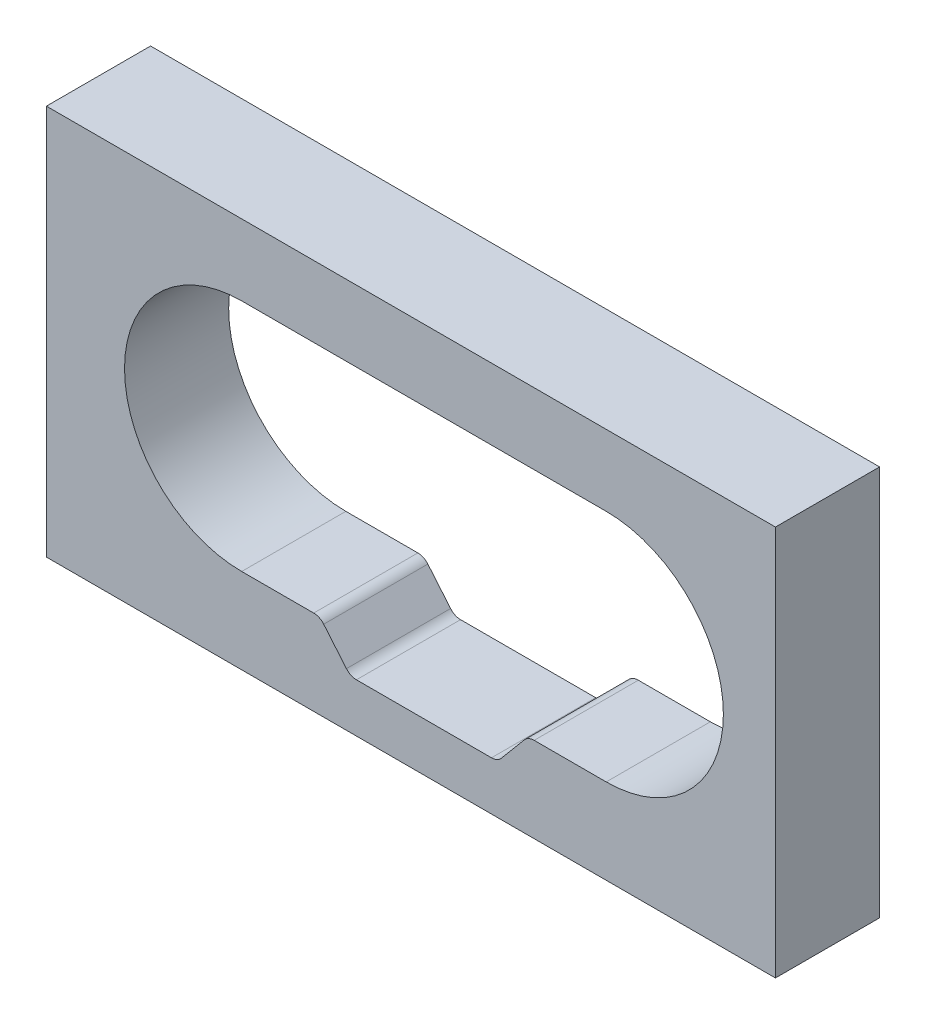
ISO-10303-21;
HEADER;
FILE_DESCRIPTION(('STEP AP214'),'2;1');
FILE_NAME('part.step','',(''),(''),'','','');
FILE_SCHEMA(('AUTOMOTIVE_DESIGN { 1 0 10303 214 1 1 1 1 }'));
ENDSEC;
DATA;
#1=APPLICATION_CONTEXT('core data for automotive mechanical design processes');
#2=APPLICATION_PROTOCOL_DEFINITION('international standard','automotive_design',2000,#1);
#3=PRODUCT_CONTEXT('',#1,'mechanical');
#4=PRODUCT('Part','Part','',(#3));
#5=PRODUCT_RELATED_PRODUCT_CATEGORY('part','',(#4));
#6=PRODUCT_DEFINITION_FORMATION('','',#4);
#7=PRODUCT_DEFINITION_CONTEXT('part definition',#1,'design');
#8=PRODUCT_DEFINITION('design','',#6,#7);
#9=PRODUCT_DEFINITION_SHAPE('','',#8);
#10=(LENGTH_UNIT() NAMED_UNIT(*) SI_UNIT(.MILLI.,.METRE.));
#11=(NAMED_UNIT(*) PLANE_ANGLE_UNIT() SI_UNIT($,.RADIAN.));
#12=(NAMED_UNIT(*) SI_UNIT($,.STERADIAN.) SOLID_ANGLE_UNIT());
#13=UNCERTAINTY_MEASURE_WITH_UNIT(LENGTH_MEASURE(1.E-05),#10,'distance_accuracy_value','');
#14=(GEOMETRIC_REPRESENTATION_CONTEXT(3) GLOBAL_UNCERTAINTY_ASSIGNED_CONTEXT((#13)) GLOBAL_UNIT_ASSIGNED_CONTEXT((#10,
#11,#12)) REPRESENTATION_CONTEXT('',''));
#15=CARTESIAN_POINT('',(0.,0.,0.));
#16=DIRECTION('',(0.,0.,1.));
#17=DIRECTION('',(1.,0.,0.));
#18=AXIS2_PLACEMENT_3D('',#15,#16,#17);
#19=CARTESIAN_POINT('',(0.,0.,8.));
#20=DIRECTION('',(0.,0.,1.));
#21=DIRECTION('',(1.,0.,0.));
#22=AXIS2_PLACEMENT_3D('',#19,#20,#21);
#23=PLANE('',#22);
#24=DIRECTION('',(0.,-1.,0.));
#25=VECTOR('',#24,1.);
#26=CARTESIAN_POINT('',(-15.,14.4560336796941,8.));
#27=LINE('',#26,#25);
#28=CARTESIAN_POINT('',(-15.,14.4560336796941,8.));
#29=VERTEX_POINT('',#28);
#30=CARTESIAN_POINT('',(-15.,-15.5439663203059,8.));
#31=VERTEX_POINT('',#30);
#32=EDGE_CURVE('E221',#29,#31,#27,.T.);
#33=ORIENTED_EDGE('',*,*,#32,.T.);
#34=DIRECTION('',(1.,0.,0.));
#35=VECTOR('',#34,1.);
#36=CARTESIAN_POINT('',(-15.,-15.5439663203059,8.));
#37=LINE('',#36,#35);
#38=CARTESIAN_POINT('',(41.,-15.5439663203059,8.));
#39=VERTEX_POINT('',#38);
#40=EDGE_CURVE('E224',#31,#39,#37,.T.);
#41=ORIENTED_EDGE('',*,*,#40,.T.);
#42=DIRECTION('',(0.,1.,0.));
#43=VECTOR('',#42,1.);
#44=CARTESIAN_POINT('',(41.,14.4560336796941,8.));
#45=LINE('',#44,#43);
#46=CARTESIAN_POINT('',(41.,14.4560336796941,8.));
#47=VERTEX_POINT('',#46);
#48=EDGE_CURVE('E227',#39,#47,#45,.T.);
#49=ORIENTED_EDGE('',*,*,#48,.T.);
#50=DIRECTION('',(-1.,0.,0.));
#51=VECTOR('',#50,1.);
#52=CARTESIAN_POINT('',(-15.,14.4560336796941,8.));
#53=LINE('',#52,#51);
#54=EDGE_CURVE('E229',#47,#29,#53,.T.);
#55=ORIENTED_EDGE('',*,*,#54,.T.);
#56=EDGE_LOOP('',(#33,#41,#49,#55));
#57=FACE_BOUND('',#56,.T.);
#58=DIRECTION('',(1.,0.,0.));
#59=VECTOR('',#58,1.);
#60=CARTESIAN_POINT('',(28.,-9.,8.));
#61=LINE('',#60,#59);
#62=CARTESIAN_POINT('',(22.466892999998,-9.,8.));
#63=VERTEX_POINT('',#62);
#64=CARTESIAN_POINT('',(28.,-9.,8.));
#65=VERTEX_POINT('',#64);
#66=EDGE_CURVE('E190',#63,#65,#61,.T.);
#67=ORIENTED_EDGE('',*,*,#66,.F.);
#68=CARTESIAN_POINT('',(22.466892999998,-10.,8.));
#69=DIRECTION('',(0.,0.,1.));
#70=DIRECTION('',(1.,0.,0.));
#71=AXIS2_PLACEMENT_3D('',#68,#69,#70);
#72=CIRCLE('',#71,1.);
#73=CARTESIAN_POINT('',(21.700230949941,-9.35794914453574,8.));
#74=VERTEX_POINT('',#73);
#75=EDGE_CURVE('E262',#63,#74,#72,.T.);
#76=ORIENTED_EDGE('',*,*,#75,.T.);
#77=DIRECTION('',(0.642050855464262,0.766662050057005,0.));
#78=VECTOR('',#77,1.);
#79=CARTESIAN_POINT('',(22.,-9.,8.));
#80=LINE('',#79,#78);
#81=CARTESIAN_POINT('',(19.9548735447105,-11.4420508554643,8.));
#82=VERTEX_POINT('',#81);
#83=EDGE_CURVE('E187',#82,#74,#80,.T.);
#84=ORIENTED_EDGE('',*,*,#83,.F.);
#85=CARTESIAN_POINT('',(19.1882114946535,-10.8,8.));
#86=DIRECTION('',(0.,0.,1.));
#87=DIRECTION('',(1.,0.,0.));
#88=AXIS2_PLACEMENT_3D('',#85,#86,#87);
#89=CIRCLE('',#88,1.);
#90=CARTESIAN_POINT('',(19.1882114946535,-11.8,8.));
#91=VERTEX_POINT('',#90);
#92=EDGE_CURVE('E277',#82,#91,#89,.F.);
#93=ORIENTED_EDGE('',*,*,#92,.T.);
#94=DIRECTION('',(1.,0.,0.));
#95=VECTOR('',#94,1.);
#96=CARTESIAN_POINT('',(8.34489550534849,-11.8,8.));
#97=LINE('',#96,#95);
#98=CARTESIAN_POINT('',(8.8117885053465,-11.8,8.));
#99=VERTEX_POINT('',#98);
#100=EDGE_CURVE('E182',#99,#91,#97,.T.);
#101=ORIENTED_EDGE('',*,*,#100,.F.);
#102=CARTESIAN_POINT('',(8.8117885053465,-10.8,8.));
#103=DIRECTION('',(0.,0.,1.));
#104=DIRECTION('',(1.,0.,0.));
#105=AXIS2_PLACEMENT_3D('',#102,#103,#104);
#106=CIRCLE('',#105,1.);
#107=CARTESIAN_POINT('',(8.0451264552895,-11.4420508554643,8.));
#108=VERTEX_POINT('',#107);
#109=EDGE_CURVE('E11',#99,#108,#106,.F.);
#110=ORIENTED_EDGE('',*,*,#109,.T.);
#111=DIRECTION('',(0.642050855464261,-0.766662050057005,0.));
#112=VECTOR('',#111,1.);
#113=CARTESIAN_POINT('',(6.,-9.,8.));
#114=LINE('',#113,#112);
#115=CARTESIAN_POINT('',(6.299769050059,-9.35794914453574,8.));
#116=VERTEX_POINT('',#115);
#117=EDGE_CURVE('E180',#116,#108,#114,.T.);
#118=ORIENTED_EDGE('',*,*,#117,.F.);
#119=CARTESIAN_POINT('',(5.53310700000199,-10.,8.));
#120=DIRECTION('',(0.,0.,1.));
#121=DIRECTION('',(1.,0.,0.));
#122=AXIS2_PLACEMENT_3D('',#119,#120,#121);
#123=CIRCLE('',#122,1.);
#124=CARTESIAN_POINT('',(5.53310700000199,-9.,8.));
#125=VERTEX_POINT('',#124);
#126=EDGE_CURVE('E179',#116,#125,#123,.T.);
#127=ORIENTED_EDGE('',*,*,#126,.T.);
#128=DIRECTION('',(1.,0.,0.));
#129=VECTOR('',#128,1.);
#130=CARTESIAN_POINT('',(0.,-9.,8.));
#131=LINE('',#130,#129);
#132=CARTESIAN_POINT('',(0.,-9.,8.));
#133=VERTEX_POINT('',#132);
#134=EDGE_CURVE('E164',#133,#125,#131,.T.);
#135=ORIENTED_EDGE('',*,*,#134,.F.);
#136=CARTESIAN_POINT('',(0.,0.,8.));
#137=DIRECTION('',(0.,0.,1.));
#138=DIRECTION('',(1.,0.,0.));
#139=AXIS2_PLACEMENT_3D('',#136,#137,#138);
#140=CIRCLE('',#139,9.);
#141=CARTESIAN_POINT('',(0.,9.,8.));
#142=VERTEX_POINT('',#141);
#143=EDGE_CURVE('E155',#142,#133,#140,.T.);
#144=ORIENTED_EDGE('',*,*,#143,.F.);
#145=DIRECTION('',(-1.,0.,0.));
#146=VECTOR('',#145,1.);
#147=CARTESIAN_POINT('',(0.,9.,8.));
#148=LINE('',#147,#146);
#149=CARTESIAN_POINT('',(28.,9.,8.));
#150=VERTEX_POINT('',#149);
#151=EDGE_CURVE('E195',#150,#142,#148,.T.);
#152=ORIENTED_EDGE('',*,*,#151,.F.);
#153=CARTESIAN_POINT('',(28.,0.,8.));
#154=DIRECTION('',(0.,0.,1.));
#155=DIRECTION('',(1.,0.,0.));
#156=AXIS2_PLACEMENT_3D('',#153,#154,#155);
#157=CIRCLE('',#156,9.);
#158=EDGE_CURVE('E192',#65,#150,#157,.T.);
#159=ORIENTED_EDGE('',*,*,#158,.F.);
#160=EDGE_LOOP('',(#67,#76,#84,#93,#101,#110,#118,#127,#135,#144,#152,#159));
#161=FACE_BOUND('',#160,.T.);
#162=ADVANCED_FACE('F41',(#57,#161),#23,.T.);
#163=CARTESIAN_POINT('',(0.,0.,0.));
#164=DIRECTION('',(0.,0.,1.));
#165=DIRECTION('',(1.,0.,0.));
#166=AXIS2_PLACEMENT_3D('',#163,#164,#165);
#167=PLANE('',#166);
#168=DIRECTION('',(0.,-1.,0.));
#169=VECTOR('',#168,1.);
#170=CARTESIAN_POINT('',(-15.,14.4560336796941,0.));
#171=LINE('',#170,#169);
#172=CARTESIAN_POINT('',(-15.,14.4560336796941,0.));
#173=VERTEX_POINT('',#172);
#174=CARTESIAN_POINT('',(-15.,-15.5439663203059,0.));
#175=VERTEX_POINT('',#174);
#176=EDGE_CURVE('E174',#173,#175,#171,.T.);
#177=ORIENTED_EDGE('',*,*,#176,.F.);
#178=DIRECTION('',(-1.,0.,0.));
#179=VECTOR('',#178,1.);
#180=CARTESIAN_POINT('',(-15.,14.4560336796941,0.));
#181=LINE('',#180,#179);
#182=CARTESIAN_POINT('',(41.,14.4560336796941,0.));
#183=VERTEX_POINT('',#182);
#184=EDGE_CURVE('E225',#183,#173,#181,.T.);
#185=ORIENTED_EDGE('',*,*,#184,.F.);
#186=DIRECTION('',(0.,1.,0.));
#187=VECTOR('',#186,1.);
#188=CARTESIAN_POINT('',(41.,14.4560336796941,0.));
#189=LINE('',#188,#187);
#190=CARTESIAN_POINT('',(41.,-15.5439663203059,0.));
#191=VERTEX_POINT('',#190);
#192=EDGE_CURVE('E236',#191,#183,#189,.T.);
#193=ORIENTED_EDGE('',*,*,#192,.F.);
#194=DIRECTION('',(1.,0.,0.));
#195=VECTOR('',#194,1.);
#196=CARTESIAN_POINT('',(-15.,-15.5439663203059,0.));
#197=LINE('',#196,#195);
#198=EDGE_CURVE('E234',#175,#191,#197,.T.);
#199=ORIENTED_EDGE('',*,*,#198,.F.);
#200=EDGE_LOOP('',(#177,#185,#193,#199));
#201=FACE_BOUND('',#200,.T.);
#202=DIRECTION('',(0.642050855464262,0.766662050057005,0.));
#203=VECTOR('',#202,1.);
#204=CARTESIAN_POINT('',(22.,-9.,0.));
#205=LINE('',#204,#203);
#206=CARTESIAN_POINT('',(19.9548735447105,-11.4420508554643,0.));
#207=VERTEX_POINT('',#206);
#208=CARTESIAN_POINT('',(21.700230949941,-9.35794914453574,0.));
#209=VERTEX_POINT('',#208);
#210=EDGE_CURVE('E206',#207,#209,#205,.T.);
#211=ORIENTED_EDGE('',*,*,#210,.T.);
#212=CARTESIAN_POINT('',(22.466892999998,-10.,0.));
#213=DIRECTION('',(0.,0.,1.));
#214=DIRECTION('',(1.,0.,0.));
#215=AXIS2_PLACEMENT_3D('',#212,#213,#214);
#216=CIRCLE('',#215,1.);
#217=CARTESIAN_POINT('',(22.466892999998,-9.,0.));
#218=VERTEX_POINT('',#217);
#219=EDGE_CURVE('E257',#209,#218,#216,.F.);
#220=ORIENTED_EDGE('',*,*,#219,.T.);
#221=DIRECTION('',(1.,0.,0.));
#222=VECTOR('',#221,1.);
#223=CARTESIAN_POINT('',(28.,-9.,0.));
#224=LINE('',#223,#222);
#225=CARTESIAN_POINT('',(28.,-9.,0.));
#226=VERTEX_POINT('',#225);
#227=EDGE_CURVE('E209',#218,#226,#224,.T.);
#228=ORIENTED_EDGE('',*,*,#227,.T.);
#229=CARTESIAN_POINT('',(28.,0.,0.));
#230=DIRECTION('',(0.,0.,1.));
#231=DIRECTION('',(1.,0.,0.));
#232=AXIS2_PLACEMENT_3D('',#229,#230,#231);
#233=CIRCLE('',#232,9.);
#234=CARTESIAN_POINT('',(28.,9.,0.));
#235=VERTEX_POINT('',#234);
#236=EDGE_CURVE('E211',#226,#235,#233,.T.);
#237=ORIENTED_EDGE('',*,*,#236,.T.);
#238=DIRECTION('',(-1.,0.,0.));
#239=VECTOR('',#238,1.);
#240=CARTESIAN_POINT('',(0.,9.,0.));
#241=LINE('',#240,#239);
#242=CARTESIAN_POINT('',(0.,9.,0.));
#243=VERTEX_POINT('',#242);
#244=EDGE_CURVE('E165',#235,#243,#241,.T.);
#245=ORIENTED_EDGE('',*,*,#244,.T.);
#246=CARTESIAN_POINT('',(0.,0.,0.));
#247=DIRECTION('',(0.,0.,1.));
#248=DIRECTION('',(1.,0.,0.));
#249=AXIS2_PLACEMENT_3D('',#246,#247,#248);
#250=CIRCLE('',#249,9.);
#251=CARTESIAN_POINT('',(0.,-9.,0.));
#252=VERTEX_POINT('',#251);
#253=EDGE_CURVE('E197',#243,#252,#250,.T.);
#254=ORIENTED_EDGE('',*,*,#253,.T.);
#255=DIRECTION('',(1.,0.,0.));
#256=VECTOR('',#255,1.);
#257=CARTESIAN_POINT('',(0.,-9.,0.));
#258=LINE('',#257,#256);
#259=CARTESIAN_POINT('',(5.53310700000199,-9.,0.));
#260=VERTEX_POINT('',#259);
#261=EDGE_CURVE('E173',#252,#260,#258,.T.);
#262=ORIENTED_EDGE('',*,*,#261,.T.);
#263=CARTESIAN_POINT('',(5.53310700000199,-10.,0.));
#264=DIRECTION('',(0.,0.,1.));
#265=DIRECTION('',(1.,0.,0.));
#266=AXIS2_PLACEMENT_3D('',#263,#264,#265);
#267=CIRCLE('',#266,1.);
#268=CARTESIAN_POINT('',(6.299769050059,-9.35794914453574,0.));
#269=VERTEX_POINT('',#268);
#270=EDGE_CURVE('E255',#260,#269,#267,.F.);
#271=ORIENTED_EDGE('',*,*,#270,.T.);
#272=DIRECTION('',(0.642050855464261,-0.766662050057005,0.));
#273=VECTOR('',#272,1.);
#274=CARTESIAN_POINT('',(6.,-9.,0.));
#275=LINE('',#274,#273);
#276=CARTESIAN_POINT('',(8.0451264552895,-11.4420508554643,0.));
#277=VERTEX_POINT('',#276);
#278=EDGE_CURVE('E200',#269,#277,#275,.T.);
#279=ORIENTED_EDGE('',*,*,#278,.T.);
#280=CARTESIAN_POINT('',(8.8117885053465,-10.8,0.));
#281=DIRECTION('',(0.,0.,1.));
#282=DIRECTION('',(1.,0.,0.));
#283=AXIS2_PLACEMENT_3D('',#280,#281,#282);
#284=CIRCLE('',#283,1.);
#285=CARTESIAN_POINT('',(8.8117885053465,-11.8,0.));
#286=VERTEX_POINT('',#285);
#287=EDGE_CURVE('E49',#277,#286,#284,.T.);
#288=ORIENTED_EDGE('',*,*,#287,.T.);
#289=DIRECTION('',(1.,0.,0.));
#290=VECTOR('',#289,1.);
#291=CARTESIAN_POINT('',(8.34489550534849,-11.8,0.));
#292=LINE('',#291,#290);
#293=CARTESIAN_POINT('',(19.1882114946535,-11.8,0.));
#294=VERTEX_POINT('',#293);
#295=EDGE_CURVE('E203',#286,#294,#292,.T.);
#296=ORIENTED_EDGE('',*,*,#295,.T.);
#297=CARTESIAN_POINT('',(19.1882114946535,-10.8,0.));
#298=DIRECTION('',(0.,0.,1.));
#299=DIRECTION('',(1.,0.,0.));
#300=AXIS2_PLACEMENT_3D('',#297,#298,#299);
#301=CIRCLE('',#300,1.);
#302=EDGE_CURVE('E275',#294,#207,#301,.T.);
#303=ORIENTED_EDGE('',*,*,#302,.T.);
#304=EDGE_LOOP('',(#211,#220,#228,#237,#245,#254,#262,#271,#279,#288,#296,#303));
#305=FACE_BOUND('',#304,.T.);
#306=ADVANCED_FACE('F280',(#201,#305),#167,.F.);
#307=CARTESIAN_POINT('',(-15.,14.4560336796941,8.));
#308=DIRECTION('',(1.,0.,0.));
#309=DIRECTION('',(0.,1.,0.));
#310=AXIS2_PLACEMENT_3D('',#307,#308,#309);
#311=PLANE('',#310);
#312=ORIENTED_EDGE('',*,*,#176,.T.);
#313=DIRECTION('',(0.,0.,-1.));
#314=VECTOR('',#313,1.);
#315=CARTESIAN_POINT('',(-15.,-15.5439663203059,8.));
#316=LINE('',#315,#314);
#317=EDGE_CURVE('E247',#31,#175,#316,.T.);
#318=ORIENTED_EDGE('',*,*,#317,.F.);
#319=ORIENTED_EDGE('',*,*,#32,.F.);
#320=DIRECTION('',(0.,0.,-1.));
#321=VECTOR('',#320,1.);
#322=CARTESIAN_POINT('',(-15.,14.4560336796941,8.));
#323=LINE('',#322,#321);
#324=EDGE_CURVE('E231',#29,#173,#323,.T.);
#325=ORIENTED_EDGE('',*,*,#324,.T.);
#326=EDGE_LOOP('',(#312,#318,#319,#325));
#327=FACE_BOUND('',#326,.T.);
#328=ADVANCED_FACE('F328',(#327),#311,.F.);
#329=CARTESIAN_POINT('',(-15.,-15.5439663203059,8.));
#330=DIRECTION('',(0.,1.,0.));
#331=DIRECTION('',(0.,0.,1.));
#332=AXIS2_PLACEMENT_3D('',#329,#330,#331);
#333=PLANE('',#332);
#334=ORIENTED_EDGE('',*,*,#198,.T.);
#335=DIRECTION('',(0.,0.,-1.));
#336=VECTOR('',#335,1.);
#337=CARTESIAN_POINT('',(41.,-15.5439663203059,8.));
#338=LINE('',#337,#336);
#339=EDGE_CURVE('E244',#39,#191,#338,.T.);
#340=ORIENTED_EDGE('',*,*,#339,.F.);
#341=ORIENTED_EDGE('',*,*,#40,.F.);
#342=ORIENTED_EDGE('',*,*,#317,.T.);
#343=EDGE_LOOP('',(#334,#340,#341,#342));
#344=FACE_BOUND('',#343,.T.);
#345=ADVANCED_FACE('F341',(#344),#333,.F.);
#346=CARTESIAN_POINT('',(41.,14.4560336796941,8.));
#347=DIRECTION('',(-1.,0.,0.));
#348=DIRECTION('',(0.,-1.,0.));
#349=AXIS2_PLACEMENT_3D('',#346,#347,#348);
#350=PLANE('',#349);
#351=ORIENTED_EDGE('',*,*,#192,.T.);
#352=DIRECTION('',(0.,0.,-1.));
#353=VECTOR('',#352,1.);
#354=CARTESIAN_POINT('',(41.,14.4560336796941,8.));
#355=LINE('',#354,#353);
#356=EDGE_CURVE('E241',#47,#183,#355,.T.);
#357=ORIENTED_EDGE('',*,*,#356,.F.);
#358=ORIENTED_EDGE('',*,*,#48,.F.);
#359=ORIENTED_EDGE('',*,*,#339,.T.);
#360=EDGE_LOOP('',(#351,#357,#358,#359));
#361=FACE_BOUND('',#360,.T.);
#362=ADVANCED_FACE('F337',(#361),#350,.F.);
#363=CARTESIAN_POINT('',(-15.,14.4560336796941,8.));
#364=DIRECTION('',(0.,-1.,0.));
#365=DIRECTION('',(0.,0.,-1.));
#366=AXIS2_PLACEMENT_3D('',#363,#364,#365);
#367=PLANE('',#366);
#368=ORIENTED_EDGE('',*,*,#184,.T.);
#369=ORIENTED_EDGE('',*,*,#324,.F.);
#370=ORIENTED_EDGE('',*,*,#54,.F.);
#371=ORIENTED_EDGE('',*,*,#356,.T.);
#372=EDGE_LOOP('',(#368,#369,#370,#371));
#373=FACE_BOUND('',#372,.T.);
#374=ADVANCED_FACE('F334',(#373),#367,.F.);
#375=CARTESIAN_POINT('',(0.,0.,8.));
#376=DIRECTION('',(0.,0.,-1.));
#377=DIRECTION('',(-1.,0.,0.));
#378=AXIS2_PLACEMENT_3D('',#375,#376,#377);
#379=CYLINDRICAL_SURFACE('',#378,9.);
#380=ORIENTED_EDGE('',*,*,#253,.F.);
#381=DIRECTION('',(0.,0.,-1.));
#382=VECTOR('',#381,1.);
#383=CARTESIAN_POINT('',(0.,9.,8.));
#384=LINE('',#383,#382);
#385=EDGE_CURVE('E161',#142,#243,#384,.T.);
#386=ORIENTED_EDGE('',*,*,#385,.F.);
#387=ORIENTED_EDGE('',*,*,#143,.T.);
#388=DIRECTION('',(0.,0.,-1.));
#389=VECTOR('',#388,1.);
#390=CARTESIAN_POINT('',(0.,-9.,8.));
#391=LINE('',#390,#389);
#392=EDGE_CURVE('E158',#133,#252,#391,.T.);
#393=ORIENTED_EDGE('',*,*,#392,.T.);
#394=EDGE_LOOP('',(#380,#386,#387,#393));
#395=FACE_BOUND('',#394,.T.);
#396=ADVANCED_FACE('F157',(#395),#379,.F.);
#397=CARTESIAN_POINT('',(0.,-9.,8.));
#398=DIRECTION('',(0.,1.,0.));
#399=DIRECTION('',(0.,0.,1.));
#400=AXIS2_PLACEMENT_3D('',#397,#398,#399);
#401=PLANE('',#400);
#402=ORIENTED_EDGE('',*,*,#134,.T.);
#403=DIRECTION('',(0.,0.,-1.));
#404=VECTOR('',#403,1.);
#405=CARTESIAN_POINT('',(5.53310700000199,-9.,8.));
#406=LINE('',#405,#404);
#407=EDGE_CURVE('E269',#125,#260,#406,.T.);
#408=ORIENTED_EDGE('',*,*,#407,.T.);
#409=ORIENTED_EDGE('',*,*,#261,.F.);
#410=ORIENTED_EDGE('',*,*,#392,.F.);
#411=EDGE_LOOP('',(#402,#408,#409,#410));
#412=FACE_BOUND('',#411,.T.);
#413=ADVANCED_FACE('F169',(#412),#401,.T.);
#414=CARTESIAN_POINT('',(6.,-9.,8.));
#415=DIRECTION('',(0.766662050057005,0.642050855464261,0.));
#416=DIRECTION('',(-0.642050855464261,0.766662050057005,0.));
#417=AXIS2_PLACEMENT_3D('',#414,#415,#416);
#418=PLANE('',#417);
#419=ORIENTED_EDGE('',*,*,#278,.F.);
#420=DIRECTION('',(0.,0.,-1.));
#421=VECTOR('',#420,1.);
#422=CARTESIAN_POINT('',(6.299769050059,-9.35794914453574,8.));
#423=LINE('',#422,#421);
#424=EDGE_CURVE('E61',#269,#116,#423,.F.);
#425=ORIENTED_EDGE('',*,*,#424,.T.);
#426=ORIENTED_EDGE('',*,*,#117,.T.);
#427=DIRECTION('',(0.,0.,-1.));
#428=VECTOR('',#427,1.);
#429=CARTESIAN_POINT('',(8.0451264552895,-11.4420508554643,0.));
#430=LINE('',#429,#428);
#431=EDGE_CURVE('E271',#108,#277,#430,.T.);
#432=ORIENTED_EDGE('',*,*,#431,.T.);
#433=EDGE_LOOP('',(#419,#425,#426,#432));
#434=FACE_BOUND('',#433,.T.);
#435=ADVANCED_FACE('F287',(#434),#418,.T.);
#436=CARTESIAN_POINT('',(8.34489550534849,-11.8,8.));
#437=DIRECTION('',(0.,1.,0.));
#438=DIRECTION('',(-1.,0.,0.));
#439=AXIS2_PLACEMENT_3D('',#436,#437,#438);
#440=PLANE('',#439);
#441=ORIENTED_EDGE('',*,*,#100,.T.);
#442=DIRECTION('',(0.,0.,-1.));
#443=VECTOR('',#442,1.);
#444=CARTESIAN_POINT('',(19.1882114946535,-11.8,0.));
#445=LINE('',#444,#443);
#446=EDGE_CURVE('E266',#91,#294,#445,.T.);
#447=ORIENTED_EDGE('',*,*,#446,.T.);
#448=ORIENTED_EDGE('',*,*,#295,.F.);
#449=DIRECTION('',(0.,0.,-1.));
#450=VECTOR('',#449,1.);
#451=CARTESIAN_POINT('',(8.8117885053465,-11.8,8.));
#452=LINE('',#451,#450);
#453=EDGE_CURVE('E264',#286,#99,#452,.F.);
#454=ORIENTED_EDGE('',*,*,#453,.T.);
#455=EDGE_LOOP('',(#441,#447,#448,#454));
#456=FACE_BOUND('',#455,.T.);
#457=ADVANCED_FACE('F285',(#456),#440,.T.);
#458=CARTESIAN_POINT('',(22.,-9.,8.));
#459=DIRECTION('',(-0.766662050057005,0.642050855464262,0.));
#460=DIRECTION('',(-0.642050855464262,-0.766662050057005,0.));
#461=AXIS2_PLACEMENT_3D('',#458,#459,#460);
#462=PLANE('',#461);
#463=ORIENTED_EDGE('',*,*,#83,.T.);
#464=DIRECTION('',(0.,0.,-1.));
#465=VECTOR('',#464,1.);
#466=CARTESIAN_POINT('',(21.700230949941,-9.35794914453574,8.));
#467=LINE('',#466,#465);
#468=EDGE_CURVE('E252',#74,#209,#467,.T.);
#469=ORIENTED_EDGE('',*,*,#468,.T.);
#470=ORIENTED_EDGE('',*,*,#210,.F.);
#471=DIRECTION('',(0.,0.,-1.));
#472=VECTOR('',#471,1.);
#473=CARTESIAN_POINT('',(19.9548735447105,-11.4420508554643,8.));
#474=LINE('',#473,#472);
#475=EDGE_CURVE('E250',#207,#82,#474,.F.);
#476=ORIENTED_EDGE('',*,*,#475,.T.);
#477=EDGE_LOOP('',(#463,#469,#470,#476));
#478=FACE_BOUND('',#477,.T.);
#479=ADVANCED_FACE('F309',(#478),#462,.T.);
#480=CARTESIAN_POINT('',(28.,-9.,8.));
#481=DIRECTION('',(0.,1.,0.));
#482=DIRECTION('',(0.,0.,1.));
#483=AXIS2_PLACEMENT_3D('',#480,#481,#482);
#484=PLANE('',#483);
#485=ORIENTED_EDGE('',*,*,#227,.F.);
#486=DIRECTION('',(0.,0.,-1.));
#487=VECTOR('',#486,1.);
#488=CARTESIAN_POINT('',(22.466892999998,-9.,8.));
#489=LINE('',#488,#487);
#490=EDGE_CURVE('E259',#218,#63,#489,.F.);
#491=ORIENTED_EDGE('',*,*,#490,.T.);
#492=ORIENTED_EDGE('',*,*,#66,.T.);
#493=DIRECTION('',(0.,0.,-1.));
#494=VECTOR('',#493,1.);
#495=CARTESIAN_POINT('',(28.,-9.,8.));
#496=LINE('',#495,#494);
#497=EDGE_CURVE('E175',#65,#226,#496,.T.);
#498=ORIENTED_EDGE('',*,*,#497,.T.);
#499=EDGE_LOOP('',(#485,#491,#492,#498));
#500=FACE_BOUND('',#499,.T.);
#501=ADVANCED_FACE('F301',(#500),#484,.T.);
#502=CARTESIAN_POINT('',(28.,0.,8.));
#503=DIRECTION('',(0.,0.,-1.));
#504=DIRECTION('',(-1.,0.,0.));
#505=AXIS2_PLACEMENT_3D('',#502,#503,#504);
#506=CYLINDRICAL_SURFACE('',#505,9.);
#507=ORIENTED_EDGE('',*,*,#236,.F.);
#508=ORIENTED_EDGE('',*,*,#497,.F.);
#509=ORIENTED_EDGE('',*,*,#158,.T.);
#510=DIRECTION('',(0.,0.,-1.));
#511=VECTOR('',#510,1.);
#512=CARTESIAN_POINT('',(28.,9.,8.));
#513=LINE('',#512,#511);
#514=EDGE_CURVE('E217',#150,#235,#513,.T.);
#515=ORIENTED_EDGE('',*,*,#514,.T.);
#516=EDGE_LOOP('',(#507,#508,#509,#515));
#517=FACE_BOUND('',#516,.T.);
#518=ADVANCED_FACE('F298',(#517),#506,.F.);
#519=CARTESIAN_POINT('',(0.,9.,8.));
#520=DIRECTION('',(0.,-1.,0.));
#521=DIRECTION('',(0.,0.,-1.));
#522=AXIS2_PLACEMENT_3D('',#519,#520,#521);
#523=PLANE('',#522);
#524=ORIENTED_EDGE('',*,*,#244,.F.);
#525=ORIENTED_EDGE('',*,*,#514,.F.);
#526=ORIENTED_EDGE('',*,*,#151,.T.);
#527=ORIENTED_EDGE('',*,*,#385,.T.);
#528=EDGE_LOOP('',(#524,#525,#526,#527));
#529=FACE_BOUND('',#528,.T.);
#530=ADVANCED_FACE('F292',(#529),#523,.T.);
#531=CARTESIAN_POINT('',(22.466892999998,-10.,8.));
#532=DIRECTION('',(0.,0.,-1.));
#533=DIRECTION('',(-1.,0.,0.));
#534=AXIS2_PLACEMENT_3D('',#531,#532,#533);
#535=CYLINDRICAL_SURFACE('',#534,1.);
#536=ORIENTED_EDGE('',*,*,#75,.F.);
#537=ORIENTED_EDGE('',*,*,#490,.F.);
#538=ORIENTED_EDGE('',*,*,#219,.F.);
#539=ORIENTED_EDGE('',*,*,#468,.F.);
#540=EDGE_LOOP('',(#536,#537,#538,#539));
#541=FACE_BOUND('',#540,.T.);
#542=ADVANCED_FACE('F304',(#541),#535,.T.);
#543=CARTESIAN_POINT('',(19.1882114946535,-10.8,8.));
#544=DIRECTION('',(0.,0.,1.));
#545=DIRECTION('',(1.,0.,0.));
#546=AXIS2_PLACEMENT_3D('',#543,#544,#545);
#547=CYLINDRICAL_SURFACE('',#546,1.);
#548=ORIENTED_EDGE('',*,*,#92,.F.);
#549=ORIENTED_EDGE('',*,*,#475,.F.);
#550=ORIENTED_EDGE('',*,*,#302,.F.);
#551=ORIENTED_EDGE('',*,*,#446,.F.);
#552=EDGE_LOOP('',(#548,#549,#550,#551));
#553=FACE_BOUND('',#552,.T.);
#554=ADVANCED_FACE('F313',(#553),#547,.F.);
#555=CARTESIAN_POINT('',(5.53310700000199,-10.,8.));
#556=DIRECTION('',(0.,0.,-1.));
#557=DIRECTION('',(-1.,0.,0.));
#558=AXIS2_PLACEMENT_3D('',#555,#556,#557);
#559=CYLINDRICAL_SURFACE('',#558,1.);
#560=ORIENTED_EDGE('',*,*,#126,.F.);
#561=ORIENTED_EDGE('',*,*,#424,.F.);
#562=ORIENTED_EDGE('',*,*,#270,.F.);
#563=ORIENTED_EDGE('',*,*,#407,.F.);
#564=EDGE_LOOP('',(#560,#561,#562,#563));
#565=FACE_BOUND('',#564,.T.);
#566=ADVANCED_FACE('F289',(#565),#559,.T.);
#567=CARTESIAN_POINT('',(8.8117885053465,-10.8,8.));
#568=DIRECTION('',(0.,0.,1.));
#569=DIRECTION('',(1.,0.,0.));
#570=AXIS2_PLACEMENT_3D('',#567,#568,#569);
#571=CYLINDRICAL_SURFACE('',#570,1.);
#572=ORIENTED_EDGE('',*,*,#109,.F.);
#573=ORIENTED_EDGE('',*,*,#453,.F.);
#574=ORIENTED_EDGE('',*,*,#287,.F.);
#575=ORIENTED_EDGE('',*,*,#431,.F.);
#576=EDGE_LOOP('',(#572,#573,#574,#575));
#577=FACE_BOUND('',#576,.T.);
#578=ADVANCED_FACE('F43',(#577),#571,.F.);
#579=CLOSED_SHELL('',(#162,#306,#328,#345,#362,#374,#396,#413,#435,#457,#479,#501,#518,#530,
#542,#554,#566,#578));
#580=MANIFOLD_SOLID_BREP('B2',#579);
#581=ADVANCED_BREP_SHAPE_REPRESENTATION('',(#18,#580),#14);
#582=SHAPE_DEFINITION_REPRESENTATION(#9,#581);
ENDSEC;
END-ISO-10303-21;
